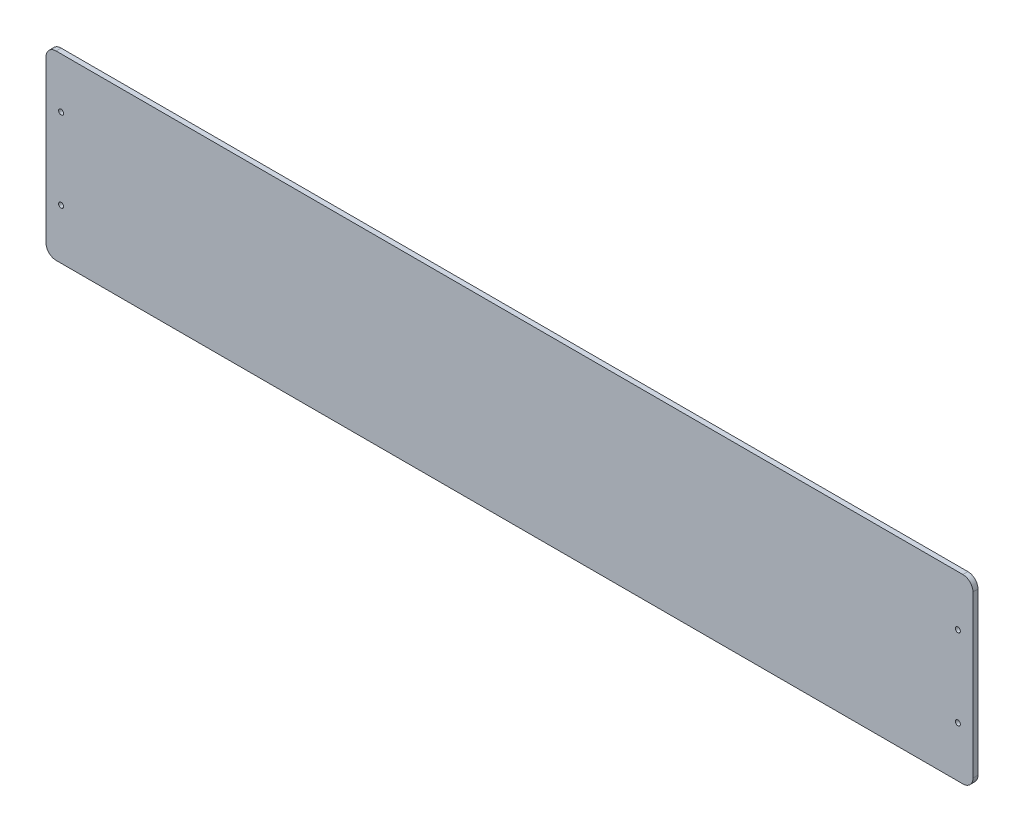
ISO-10303-21;
HEADER;
FILE_DESCRIPTION(('STEP AP214'),'2;1');
FILE_NAME('part.step','',(''),(''),'','','');
FILE_SCHEMA(('AUTOMOTIVE_DESIGN { 1 0 10303 214 1 1 1 1 }'));
ENDSEC;
DATA;
#1=APPLICATION_CONTEXT('core data for automotive mechanical design processes');
#2=APPLICATION_PROTOCOL_DEFINITION('international standard','automotive_design',2000,#1);
#3=PRODUCT_CONTEXT('',#1,'mechanical');
#4=PRODUCT('Part','Part','',(#3));
#5=PRODUCT_RELATED_PRODUCT_CATEGORY('part','',(#4));
#6=PRODUCT_DEFINITION_FORMATION('','',#4);
#7=PRODUCT_DEFINITION_CONTEXT('part definition',#1,'design');
#8=PRODUCT_DEFINITION('design','',#6,#7);
#9=PRODUCT_DEFINITION_SHAPE('','',#8);
#10=(LENGTH_UNIT() NAMED_UNIT(*) SI_UNIT(.MILLI.,.METRE.));
#11=(NAMED_UNIT(*) PLANE_ANGLE_UNIT() SI_UNIT($,.RADIAN.));
#12=(NAMED_UNIT(*) SI_UNIT($,.STERADIAN.) SOLID_ANGLE_UNIT());
#13=UNCERTAINTY_MEASURE_WITH_UNIT(LENGTH_MEASURE(1.E-05),#10,'distance_accuracy_value','');
#14=(GEOMETRIC_REPRESENTATION_CONTEXT(3) GLOBAL_UNCERTAINTY_ASSIGNED_CONTEXT((#13)) GLOBAL_UNIT_ASSIGNED_CONTEXT((#10,
#11,#12)) REPRESENTATION_CONTEXT('',''));
#15=CARTESIAN_POINT('',(0.,0.,0.));
#16=DIRECTION('',(0.,0.,1.));
#17=DIRECTION('',(1.,0.,0.));
#18=AXIS2_PLACEMENT_3D('',#15,#16,#17);
#19=CARTESIAN_POINT('',(-460.,-90.0000000000001,5.));
#20=DIRECTION('',(1.,0.,0.));
#21=DIRECTION('',(0.,0.,-1.));
#22=AXIS2_PLACEMENT_3D('',#19,#20,#21);
#23=PLANE('',#22);
#24=DIRECTION('',(0.,-1.,0.));
#25=VECTOR('',#24,1.);
#26=CARTESIAN_POINT('',(-460.,-90.0000000000001,0.));
#27=LINE('',#26,#25);
#28=CARTESIAN_POINT('',(-460.,79.9999999999999,0.));
#29=VERTEX_POINT('',#28);
#30=CARTESIAN_POINT('',(-460.,-80.0000000000001,0.));
#31=VERTEX_POINT('',#30);
#32=EDGE_CURVE('E133',#29,#31,#27,.T.);
#33=ORIENTED_EDGE('',*,*,#32,.T.);
#34=DIRECTION('',(0.,0.,-1.));
#35=VECTOR('',#34,1.);
#36=CARTESIAN_POINT('',(-460.,-80.0000000000001,5.));
#37=LINE('',#36,#35);
#38=CARTESIAN_POINT('',(-460.,-80.0000000000001,5.));
#39=VERTEX_POINT('',#38);
#40=EDGE_CURVE('E11',#31,#39,#37,.F.);
#41=ORIENTED_EDGE('',*,*,#40,.T.);
#42=DIRECTION('',(0.,-1.,0.));
#43=VECTOR('',#42,1.);
#44=CARTESIAN_POINT('',(-460.,-90.0000000000001,5.));
#45=LINE('',#44,#43);
#46=CARTESIAN_POINT('',(-460.,79.9999999999999,5.));
#47=VERTEX_POINT('',#46);
#48=EDGE_CURVE('E131',#47,#39,#45,.T.);
#49=ORIENTED_EDGE('',*,*,#48,.F.);
#50=DIRECTION('',(0.,0.,-1.));
#51=VECTOR('',#50,1.);
#52=CARTESIAN_POINT('',(-460.,79.9999999999999,5.));
#53=LINE('',#52,#51);
#54=EDGE_CURVE('E44',#47,#29,#53,.T.);
#55=ORIENTED_EDGE('',*,*,#54,.T.);
#56=EDGE_LOOP('',(#33,#41,#49,#55));
#57=FACE_BOUND('',#56,.T.);
#58=ADVANCED_FACE('F35',(#57),#23,.F.);
#59=CARTESIAN_POINT('',(460.,-89.9999999999999,5.));
#60=DIRECTION('',(0.,1.,0.));
#61=DIRECTION('',(-1.,0.,0.));
#62=AXIS2_PLACEMENT_3D('',#59,#60,#61);
#63=PLANE('',#62);
#64=DIRECTION('',(1.,0.,0.));
#65=VECTOR('',#64,1.);
#66=CARTESIAN_POINT('',(460.,-89.9999999999999,0.));
#67=LINE('',#66,#65);
#68=CARTESIAN_POINT('',(-450.,-90.0000000000001,0.));
#69=VERTEX_POINT('',#68);
#70=CARTESIAN_POINT('',(450.,-89.9999999999999,0.));
#71=VERTEX_POINT('',#70);
#72=EDGE_CURVE('E129',#69,#71,#67,.T.);
#73=ORIENTED_EDGE('',*,*,#72,.T.);
#74=DIRECTION('',(0.,0.,-1.));
#75=VECTOR('',#74,1.);
#76=CARTESIAN_POINT('',(450.,-89.9999999999999,5.));
#77=LINE('',#76,#75);
#78=CARTESIAN_POINT('',(450.,-89.9999999999999,5.));
#79=VERTEX_POINT('',#78);
#80=EDGE_CURVE('E108',#71,#79,#77,.F.);
#81=ORIENTED_EDGE('',*,*,#80,.T.);
#82=DIRECTION('',(1.,0.,0.));
#83=VECTOR('',#82,1.);
#84=CARTESIAN_POINT('',(460.,-89.9999999999999,5.));
#85=LINE('',#84,#83);
#86=CARTESIAN_POINT('',(-450.,-90.0000000000001,5.));
#87=VERTEX_POINT('',#86);
#88=EDGE_CURVE('E185',#87,#79,#85,.T.);
#89=ORIENTED_EDGE('',*,*,#88,.F.);
#90=DIRECTION('',(0.,0.,-1.));
#91=VECTOR('',#90,1.);
#92=CARTESIAN_POINT('',(-450.,-90.0000000000001,5.));
#93=LINE('',#92,#91);
#94=EDGE_CURVE('E113',#87,#69,#93,.T.);
#95=ORIENTED_EDGE('',*,*,#94,.T.);
#96=EDGE_LOOP('',(#73,#81,#89,#95));
#97=FACE_BOUND('',#96,.T.);
#98=ADVANCED_FACE('F202',(#97),#63,.F.);
#99=CARTESIAN_POINT('',(460.,-89.9999999999999,5.));
#100=DIRECTION('',(-1.,0.,0.));
#101=DIRECTION('',(0.,0.,1.));
#102=AXIS2_PLACEMENT_3D('',#99,#100,#101);
#103=PLANE('',#102);
#104=DIRECTION('',(0.,1.,0.));
#105=VECTOR('',#104,1.);
#106=CARTESIAN_POINT('',(460.,-89.9999999999999,5.));
#107=LINE('',#106,#105);
#108=CARTESIAN_POINT('',(460.,-79.9999999999999,5.));
#109=VERTEX_POINT('',#108);
#110=CARTESIAN_POINT('',(460.,80.,5.));
#111=VERTEX_POINT('',#110);
#112=EDGE_CURVE('E122',#109,#111,#107,.T.);
#113=ORIENTED_EDGE('',*,*,#112,.F.);
#114=DIRECTION('',(0.,0.,-1.));
#115=VECTOR('',#114,1.);
#116=CARTESIAN_POINT('',(460.,-79.9999999999999,5.));
#117=LINE('',#116,#115);
#118=CARTESIAN_POINT('',(460.,-79.9999999999999,0.));
#119=VERTEX_POINT('',#118);
#120=EDGE_CURVE('E107',#109,#119,#117,.T.);
#121=ORIENTED_EDGE('',*,*,#120,.T.);
#122=DIRECTION('',(0.,1.,0.));
#123=VECTOR('',#122,1.);
#124=CARTESIAN_POINT('',(460.,-89.9999999999999,0.));
#125=LINE('',#124,#123);
#126=CARTESIAN_POINT('',(460.,80.,0.));
#127=VERTEX_POINT('',#126);
#128=EDGE_CURVE('E120',#119,#127,#125,.T.);
#129=ORIENTED_EDGE('',*,*,#128,.T.);
#130=DIRECTION('',(0.,0.,-1.));
#131=VECTOR('',#130,1.);
#132=CARTESIAN_POINT('',(460.,80.,5.));
#133=LINE('',#132,#131);
#134=EDGE_CURVE('E124',#127,#111,#133,.F.);
#135=ORIENTED_EDGE('',*,*,#134,.T.);
#136=EDGE_LOOP('',(#113,#121,#129,#135));
#137=FACE_BOUND('',#136,.T.);
#138=ADVANCED_FACE('F119',(#137),#103,.F.);
#139=CARTESIAN_POINT('',(460.,90.0000000000001,5.));
#140=DIRECTION('',(0.,-1.,0.));
#141=DIRECTION('',(1.,0.,0.));
#142=AXIS2_PLACEMENT_3D('',#139,#140,#141);
#143=PLANE('',#142);
#144=DIRECTION('',(-1.,0.,0.));
#145=VECTOR('',#144,1.);
#146=CARTESIAN_POINT('',(460.,90.0000000000001,5.));
#147=LINE('',#146,#145);
#148=CARTESIAN_POINT('',(450.,90.0000000000001,5.));
#149=VERTEX_POINT('',#148);
#150=CARTESIAN_POINT('',(-450.,89.9999999999999,5.));
#151=VERTEX_POINT('',#150);
#152=EDGE_CURVE('E137',#149,#151,#147,.T.);
#153=ORIENTED_EDGE('',*,*,#152,.F.);
#154=DIRECTION('',(0.,0.,-1.));
#155=VECTOR('',#154,1.);
#156=CARTESIAN_POINT('',(450.,90.0000000000001,5.));
#157=LINE('',#156,#155);
#158=CARTESIAN_POINT('',(450.,90.0000000000001,0.));
#159=VERTEX_POINT('',#158);
#160=EDGE_CURVE('E154',#149,#159,#157,.T.);
#161=ORIENTED_EDGE('',*,*,#160,.T.);
#162=DIRECTION('',(-1.,0.,0.));
#163=VECTOR('',#162,1.);
#164=CARTESIAN_POINT('',(460.,90.0000000000001,0.));
#165=LINE('',#164,#163);
#166=CARTESIAN_POINT('',(-450.,89.9999999999999,0.));
#167=VERTEX_POINT('',#166);
#168=EDGE_CURVE('E128',#159,#167,#165,.T.);
#169=ORIENTED_EDGE('',*,*,#168,.T.);
#170=DIRECTION('',(0.,0.,-1.));
#171=VECTOR('',#170,1.);
#172=CARTESIAN_POINT('',(-450.,89.9999999999999,5.));
#173=LINE('',#172,#171);
#174=EDGE_CURVE('E52',#167,#151,#173,.F.);
#175=ORIENTED_EDGE('',*,*,#174,.T.);
#176=EDGE_LOOP('',(#153,#161,#169,#175));
#177=FACE_BOUND('',#176,.T.);
#178=ADVANCED_FACE('F209',(#177),#143,.F.);
#179=CARTESIAN_POINT('',(-460.,89.9999999999999,5.));
#180=DIRECTION('',(0.,0.,1.));
#181=DIRECTION('',(1.,0.,0.));
#182=AXIS2_PLACEMENT_3D('',#179,#180,#181);
#183=PLANE('',#182);
#184=CARTESIAN_POINT('',(-445.,-40.,5.));
#185=DIRECTION('',(0.,0.,1.));
#186=DIRECTION('',(1.,0.,0.));
#187=AXIS2_PLACEMENT_3D('',#184,#185,#186);
#188=CIRCLE('',#187,2.50000000000002);
#189=CARTESIAN_POINT('',(-442.5,-40.,5.));
#190=VERTEX_POINT('',#189);
#191=EDGE_CURVE('E178',#190,#190,#188,.T.);
#192=ORIENTED_EDGE('',*,*,#191,.F.);
#193=EDGE_LOOP('',(#192));
#194=FACE_BOUND('',#193,.T.);
#195=CARTESIAN_POINT('',(-445.,39.9999999999999,5.));
#196=DIRECTION('',(0.,0.,1.));
#197=DIRECTION('',(-1.,0.,0.));
#198=AXIS2_PLACEMENT_3D('',#195,#196,#197);
#199=CIRCLE('',#198,2.50000000000002);
#200=CARTESIAN_POINT('',(-447.5,39.9999999999999,5.));
#201=VERTEX_POINT('',#200);
#202=EDGE_CURVE('E168',#201,#201,#199,.T.);
#203=ORIENTED_EDGE('',*,*,#202,.F.);
#204=EDGE_LOOP('',(#203));
#205=FACE_BOUND('',#204,.T.);
#206=CARTESIAN_POINT('',(445.,-40.,5.));
#207=DIRECTION('',(0.,0.,1.));
#208=DIRECTION('',(-1.,0.,0.));
#209=AXIS2_PLACEMENT_3D('',#206,#207,#208);
#210=CIRCLE('',#209,2.50000000000002);
#211=CARTESIAN_POINT('',(442.5,-40.,5.));
#212=VERTEX_POINT('',#211);
#213=EDGE_CURVE('E165',#212,#212,#210,.T.);
#214=ORIENTED_EDGE('',*,*,#213,.F.);
#215=EDGE_LOOP('',(#214));
#216=FACE_BOUND('',#215,.T.);
#217=CARTESIAN_POINT('',(445.,40.0000000000001,5.));
#218=DIRECTION('',(0.,0.,1.));
#219=DIRECTION('',(1.,0.,0.));
#220=AXIS2_PLACEMENT_3D('',#217,#218,#219);
#221=CIRCLE('',#220,2.50000000000002);
#222=CARTESIAN_POINT('',(447.5,40.0000000000001,5.));
#223=VERTEX_POINT('',#222);
#224=EDGE_CURVE('E162',#223,#223,#221,.T.);
#225=ORIENTED_EDGE('',*,*,#224,.F.);
#226=EDGE_LOOP('',(#225));
#227=FACE_BOUND('',#226,.T.);
#228=ORIENTED_EDGE('',*,*,#88,.T.);
#229=CARTESIAN_POINT('',(450.,-79.9999999999999,5.));
#230=DIRECTION('',(0.,0.,1.));
#231=DIRECTION('',(1.,0.,0.));
#232=AXIS2_PLACEMENT_3D('',#229,#230,#231);
#233=CIRCLE('',#232,10.);
#234=EDGE_CURVE('E151',#79,#109,#233,.T.);
#235=ORIENTED_EDGE('',*,*,#234,.T.);
#236=ORIENTED_EDGE('',*,*,#112,.T.);
#237=CARTESIAN_POINT('',(450.,80.0000000000001,5.));
#238=DIRECTION('',(0.,0.,1.));
#239=DIRECTION('',(1.,0.,0.));
#240=AXIS2_PLACEMENT_3D('',#237,#238,#239);
#241=CIRCLE('',#240,10.);
#242=EDGE_CURVE('E59',#111,#149,#241,.T.);
#243=ORIENTED_EDGE('',*,*,#242,.T.);
#244=ORIENTED_EDGE('',*,*,#152,.T.);
#245=CARTESIAN_POINT('',(-450.,79.9999999999999,5.));
#246=DIRECTION('',(0.,0.,1.));
#247=DIRECTION('',(1.,0.,0.));
#248=AXIS2_PLACEMENT_3D('',#245,#246,#247);
#249=CIRCLE('',#248,10.);
#250=EDGE_CURVE('E146',#151,#47,#249,.T.);
#251=ORIENTED_EDGE('',*,*,#250,.T.);
#252=ORIENTED_EDGE('',*,*,#48,.T.);
#253=CARTESIAN_POINT('',(-450.,-80.0000000000001,5.));
#254=DIRECTION('',(0.,0.,1.));
#255=DIRECTION('',(1.,0.,0.));
#256=AXIS2_PLACEMENT_3D('',#253,#254,#255);
#257=CIRCLE('',#256,10.);
#258=EDGE_CURVE('E148',#39,#87,#257,.T.);
#259=ORIENTED_EDGE('',*,*,#258,.T.);
#260=EDGE_LOOP('',(#228,#235,#236,#243,#244,#251,#252,#259));
#261=FACE_BOUND('',#260,.T.);
#262=ADVANCED_FACE('F200',(#194,#205,#216,#227,#261),#183,.T.);
#263=CARTESIAN_POINT('',(-460.,89.9999999999999,0.));
#264=DIRECTION('',(0.,0.,1.));
#265=DIRECTION('',(1.,0.,0.));
#266=AXIS2_PLACEMENT_3D('',#263,#264,#265);
#267=PLANE('',#266);
#268=CARTESIAN_POINT('',(-445.,-40.,0.));
#269=DIRECTION('',(0.,0.,1.));
#270=DIRECTION('',(1.,0.,0.));
#271=AXIS2_PLACEMENT_3D('',#268,#269,#270);
#272=CIRCLE('',#271,2.50000000000002);
#273=CARTESIAN_POINT('',(-442.5,-40.,0.));
#274=VERTEX_POINT('',#273);
#275=EDGE_CURVE('E39',#274,#274,#272,.T.);
#276=ORIENTED_EDGE('',*,*,#275,.T.);
#277=EDGE_LOOP('',(#276));
#278=FACE_BOUND('',#277,.T.);
#279=CARTESIAN_POINT('',(-445.,39.9999999999999,0.));
#280=DIRECTION('',(0.,0.,1.));
#281=DIRECTION('',(1.,0.,0.));
#282=AXIS2_PLACEMENT_3D('',#279,#280,#281);
#283=CIRCLE('',#282,2.50000000000002);
#284=CARTESIAN_POINT('',(-442.5,39.9999999999999,0.));
#285=VERTEX_POINT('',#284);
#286=EDGE_CURVE('E166',#285,#285,#283,.T.);
#287=ORIENTED_EDGE('',*,*,#286,.T.);
#288=EDGE_LOOP('',(#287));
#289=FACE_BOUND('',#288,.T.);
#290=CARTESIAN_POINT('',(445.,-40.,0.));
#291=DIRECTION('',(0.,0.,1.));
#292=DIRECTION('',(1.,0.,0.));
#293=AXIS2_PLACEMENT_3D('',#290,#291,#292);
#294=CIRCLE('',#293,2.50000000000002);
#295=CARTESIAN_POINT('',(447.5,-40.,0.));
#296=VERTEX_POINT('',#295);
#297=EDGE_CURVE('E163',#296,#296,#294,.T.);
#298=ORIENTED_EDGE('',*,*,#297,.T.);
#299=EDGE_LOOP('',(#298));
#300=FACE_BOUND('',#299,.T.);
#301=CARTESIAN_POINT('',(445.,40.0000000000001,0.));
#302=DIRECTION('',(0.,0.,1.));
#303=DIRECTION('',(1.,0.,0.));
#304=AXIS2_PLACEMENT_3D('',#301,#302,#303);
#305=CIRCLE('',#304,2.50000000000002);
#306=CARTESIAN_POINT('',(447.5,40.0000000000001,0.));
#307=VERTEX_POINT('',#306);
#308=EDGE_CURVE('E159',#307,#307,#305,.T.);
#309=ORIENTED_EDGE('',*,*,#308,.T.);
#310=EDGE_LOOP('',(#309));
#311=FACE_BOUND('',#310,.T.);
#312=ORIENTED_EDGE('',*,*,#128,.F.);
#313=CARTESIAN_POINT('',(450.,-79.9999999999999,0.));
#314=DIRECTION('',(0.,0.,1.));
#315=DIRECTION('',(1.,0.,0.));
#316=AXIS2_PLACEMENT_3D('',#313,#314,#315);
#317=CIRCLE('',#316,10.);
#318=EDGE_CURVE('E103',#119,#71,#317,.F.);
#319=ORIENTED_EDGE('',*,*,#318,.T.);
#320=ORIENTED_EDGE('',*,*,#72,.F.);
#321=CARTESIAN_POINT('',(-450.,-80.0000000000001,0.));
#322=DIRECTION('',(0.,0.,1.));
#323=DIRECTION('',(1.,0.,0.));
#324=AXIS2_PLACEMENT_3D('',#321,#322,#323);
#325=CIRCLE('',#324,10.);
#326=EDGE_CURVE('E140',#69,#31,#325,.F.);
#327=ORIENTED_EDGE('',*,*,#326,.T.);
#328=ORIENTED_EDGE('',*,*,#32,.F.);
#329=CARTESIAN_POINT('',(-450.,79.9999999999999,0.));
#330=DIRECTION('',(0.,0.,1.));
#331=DIRECTION('',(1.,0.,0.));
#332=AXIS2_PLACEMENT_3D('',#329,#330,#331);
#333=CIRCLE('',#332,10.);
#334=EDGE_CURVE('E123',#29,#167,#333,.F.);
#335=ORIENTED_EDGE('',*,*,#334,.T.);
#336=ORIENTED_EDGE('',*,*,#168,.F.);
#337=CARTESIAN_POINT('',(450.,80.0000000000001,0.));
#338=DIRECTION('',(0.,0.,1.));
#339=DIRECTION('',(1.,0.,0.));
#340=AXIS2_PLACEMENT_3D('',#337,#338,#339);
#341=CIRCLE('',#340,10.);
#342=EDGE_CURVE('E114',#159,#127,#341,.F.);
#343=ORIENTED_EDGE('',*,*,#342,.T.);
#344=EDGE_LOOP('',(#312,#319,#320,#327,#328,#335,#336,#343));
#345=FACE_BOUND('',#344,.T.);
#346=ADVANCED_FACE('F126',(#278,#289,#300,#311,#345),#267,.F.);
#347=CARTESIAN_POINT('',(450.,-79.9999999999999,5.));
#348=DIRECTION('',(0.,0.,-1.));
#349=DIRECTION('',(-1.,0.,0.));
#350=AXIS2_PLACEMENT_3D('',#347,#348,#349);
#351=CYLINDRICAL_SURFACE('',#350,10.);
#352=ORIENTED_EDGE('',*,*,#234,.F.);
#353=ORIENTED_EDGE('',*,*,#80,.F.);
#354=ORIENTED_EDGE('',*,*,#318,.F.);
#355=ORIENTED_EDGE('',*,*,#120,.F.);
#356=EDGE_LOOP('',(#352,#353,#354,#355));
#357=FACE_BOUND('',#356,.T.);
#358=ADVANCED_FACE('F106',(#357),#351,.T.);
#359=CARTESIAN_POINT('',(450.,80.0000000000001,5.));
#360=DIRECTION('',(0.,0.,-1.));
#361=DIRECTION('',(-1.,0.,0.));
#362=AXIS2_PLACEMENT_3D('',#359,#360,#361);
#363=CYLINDRICAL_SURFACE('',#362,10.);
#364=ORIENTED_EDGE('',*,*,#242,.F.);
#365=ORIENTED_EDGE('',*,*,#134,.F.);
#366=ORIENTED_EDGE('',*,*,#342,.F.);
#367=ORIENTED_EDGE('',*,*,#160,.F.);
#368=EDGE_LOOP('',(#364,#365,#366,#367));
#369=FACE_BOUND('',#368,.T.);
#370=ADVANCED_FACE('F216',(#369),#363,.T.);
#371=CARTESIAN_POINT('',(-450.,-80.0000000000001,5.));
#372=DIRECTION('',(0.,0.,-1.));
#373=DIRECTION('',(-1.,0.,0.));
#374=AXIS2_PLACEMENT_3D('',#371,#372,#373);
#375=CYLINDRICAL_SURFACE('',#374,10.);
#376=ORIENTED_EDGE('',*,*,#258,.F.);
#377=ORIENTED_EDGE('',*,*,#40,.F.);
#378=ORIENTED_EDGE('',*,*,#326,.F.);
#379=ORIENTED_EDGE('',*,*,#94,.F.);
#380=EDGE_LOOP('',(#376,#377,#378,#379));
#381=FACE_BOUND('',#380,.T.);
#382=ADVANCED_FACE('F197',(#381),#375,.T.);
#383=CARTESIAN_POINT('',(-450.,79.9999999999999,5.));
#384=DIRECTION('',(0.,0.,-1.));
#385=DIRECTION('',(-1.,0.,0.));
#386=AXIS2_PLACEMENT_3D('',#383,#384,#385);
#387=CYLINDRICAL_SURFACE('',#386,10.);
#388=ORIENTED_EDGE('',*,*,#250,.F.);
#389=ORIENTED_EDGE('',*,*,#174,.F.);
#390=ORIENTED_EDGE('',*,*,#334,.F.);
#391=ORIENTED_EDGE('',*,*,#54,.F.);
#392=EDGE_LOOP('',(#388,#389,#390,#391));
#393=FACE_BOUND('',#392,.T.);
#394=ADVANCED_FACE('F37',(#393),#387,.T.);
#395=CARTESIAN_POINT('',(445.,40.0000000000001,-5.));
#396=DIRECTION('',(0.,0.,1.));
#397=DIRECTION('',(1.,0.,0.));
#398=AXIS2_PLACEMENT_3D('',#395,#396,#397);
#399=CYLINDRICAL_SURFACE('',#398,2.50000000000002);
#400=ORIENTED_EDGE('',*,*,#224,.T.);
#401=EDGE_LOOP('',(#400));
#402=FACE_BOUND('',#401,.T.);
#403=ORIENTED_EDGE('',*,*,#308,.F.);
#404=EDGE_LOOP('',(#403));
#405=FACE_BOUND('',#404,.T.);
#406=ADVANCED_FACE('F223',(#402,#405),#399,.F.);
#407=CARTESIAN_POINT('',(445.,-40.,-5.));
#408=DIRECTION('',(0.,0.,1.));
#409=DIRECTION('',(1.,0.,0.));
#410=AXIS2_PLACEMENT_3D('',#407,#408,#409);
#411=CYLINDRICAL_SURFACE('',#410,2.50000000000002);
#412=ORIENTED_EDGE('',*,*,#213,.T.);
#413=EDGE_LOOP('',(#412));
#414=FACE_BOUND('',#413,.T.);
#415=ORIENTED_EDGE('',*,*,#297,.F.);
#416=EDGE_LOOP('',(#415));
#417=FACE_BOUND('',#416,.T.);
#418=ADVANCED_FACE('F228',(#414,#417),#411,.F.);
#419=CARTESIAN_POINT('',(-445.,39.9999999999999,-5.));
#420=DIRECTION('',(0.,0.,1.));
#421=DIRECTION('',(1.,0.,0.));
#422=AXIS2_PLACEMENT_3D('',#419,#420,#421);
#423=CYLINDRICAL_SURFACE('',#422,2.50000000000002);
#424=ORIENTED_EDGE('',*,*,#202,.T.);
#425=EDGE_LOOP('',(#424));
#426=FACE_BOUND('',#425,.T.);
#427=ORIENTED_EDGE('',*,*,#286,.F.);
#428=EDGE_LOOP('',(#427));
#429=FACE_BOUND('',#428,.T.);
#430=ADVANCED_FACE('F245',(#426,#429),#423,.F.);
#431=CARTESIAN_POINT('',(-445.,-40.,-5.));
#432=DIRECTION('',(0.,0.,1.));
#433=DIRECTION('',(1.,0.,0.));
#434=AXIS2_PLACEMENT_3D('',#431,#432,#433);
#435=CYLINDRICAL_SURFACE('',#434,2.50000000000002);
#436=ORIENTED_EDGE('',*,*,#191,.T.);
#437=EDGE_LOOP('',(#436));
#438=FACE_BOUND('',#437,.T.);
#439=ORIENTED_EDGE('',*,*,#275,.F.);
#440=EDGE_LOOP('',(#439));
#441=FACE_BOUND('',#440,.T.);
#442=ADVANCED_FACE('F249',(#438,#441),#435,.F.);
#443=CLOSED_SHELL('',(#58,#98,#138,#178,#262,#346,#358,#370,#382,#394,#406,#418,#430,#442));
#444=MANIFOLD_SOLID_BREP('B2',#443);
#445=ADVANCED_BREP_SHAPE_REPRESENTATION('',(#18,#444),#14);
#446=SHAPE_DEFINITION_REPRESENTATION(#9,#445);
ENDSEC;
END-ISO-10303-21;
